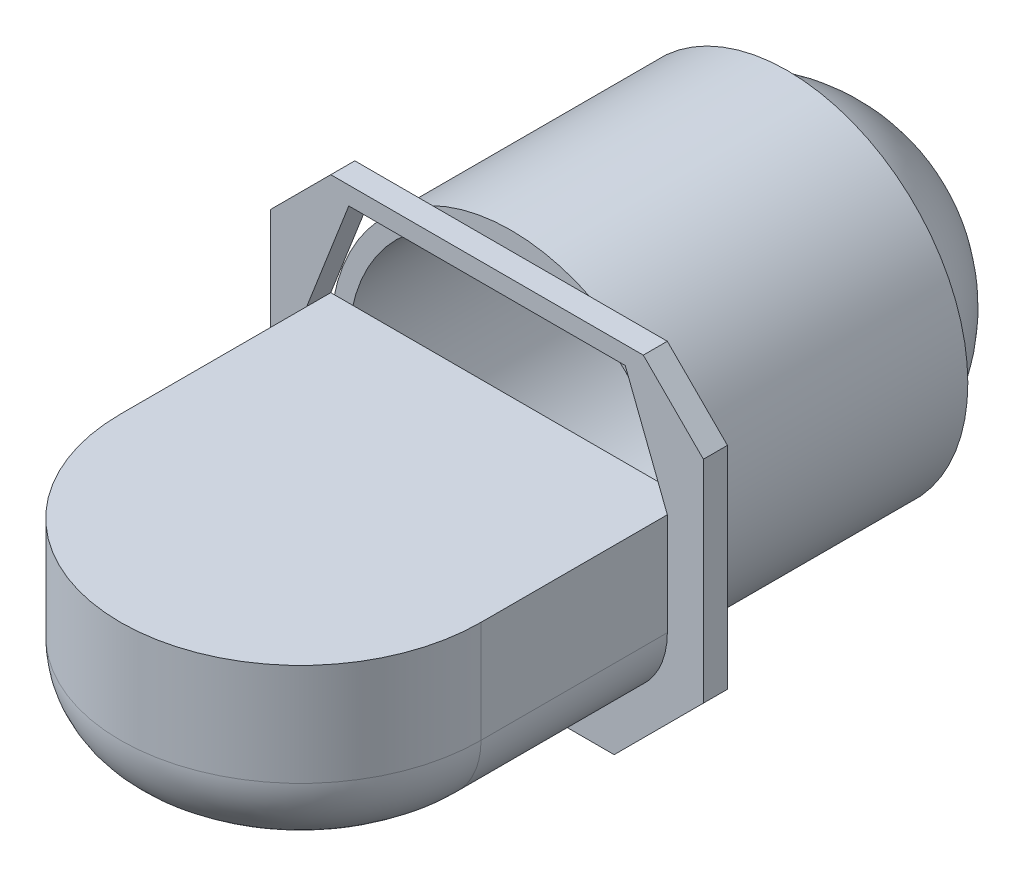
ISO-10303-21;
HEADER;
FILE_DESCRIPTION(('STEP AP214'),'2;1');
FILE_NAME('part.step','',(''),(''),'','','');
FILE_SCHEMA(('AUTOMOTIVE_DESIGN { 1 0 10303 214 1 1 1 1 }'));
ENDSEC;
DATA;
#1=APPLICATION_CONTEXT('core data for automotive mechanical design processes');
#2=APPLICATION_PROTOCOL_DEFINITION('international standard','automotive_design',2000,#1);
#3=PRODUCT_CONTEXT('',#1,'mechanical');
#4=PRODUCT('Part','Part','',(#3));
#5=PRODUCT_RELATED_PRODUCT_CATEGORY('part','',(#4));
#6=PRODUCT_DEFINITION_FORMATION('','',#4);
#7=PRODUCT_DEFINITION_CONTEXT('part definition',#1,'design');
#8=PRODUCT_DEFINITION('design','',#6,#7);
#9=PRODUCT_DEFINITION_SHAPE('','',#8);
#10=(LENGTH_UNIT() NAMED_UNIT(*) SI_UNIT(.MILLI.,.METRE.));
#11=(NAMED_UNIT(*) PLANE_ANGLE_UNIT() SI_UNIT($,.RADIAN.));
#12=(NAMED_UNIT(*) SI_UNIT($,.STERADIAN.) SOLID_ANGLE_UNIT());
#13=UNCERTAINTY_MEASURE_WITH_UNIT(LENGTH_MEASURE(1.E-05),#10,'distance_accuracy_value','');
#14=(GEOMETRIC_REPRESENTATION_CONTEXT(3) GLOBAL_UNCERTAINTY_ASSIGNED_CONTEXT((#13)) GLOBAL_UNIT_ASSIGNED_CONTEXT((#10,
#11,#12)) REPRESENTATION_CONTEXT('',''));
#15=CARTESIAN_POINT('',(0.,0.,0.));
#16=DIRECTION('',(0.,0.,1.));
#17=DIRECTION('',(1.,0.,0.));
#18=AXIS2_PLACEMENT_3D('',#15,#16,#17);
#19=CARTESIAN_POINT('',(30.,-24.,46.));
#20=DIRECTION('',(0.,0.,-1.));
#21=DIRECTION('',(-1.,0.,0.));
#22=AXIS2_PLACEMENT_3D('',#19,#20,#21);
#23=PLANE('',#22);
#24=DIRECTION('',(-1.,0.,0.));
#25=VECTOR('',#24,1.);
#26=CARTESIAN_POINT('',(30.,6.,46.));
#27=LINE('',#26,#25);
#28=CARTESIAN_POINT('',(30.,6.,46.));
#29=VERTEX_POINT('',#28);
#30=CARTESIAN_POINT('',(-30.,6.,46.));
#31=VERTEX_POINT('',#30);
#32=EDGE_CURVE('E193',#29,#31,#27,.T.);
#33=ORIENTED_EDGE('',*,*,#32,.F.);
#34=DIRECTION('',(-0.362446261154949,0.932004671541296,0.));
#35=VECTOR('',#34,1.);
#36=CARTESIAN_POINT('',(30.,6.,46.));
#37=LINE('',#36,#35);
#38=CARTESIAN_POINT('',(23.,24.,46.));
#39=VERTEX_POINT('',#38);
#40=EDGE_CURVE('E258',#29,#39,#37,.T.);
#41=ORIENTED_EDGE('',*,*,#40,.T.);
#42=DIRECTION('',(-1.,0.,0.));
#43=VECTOR('',#42,1.);
#44=CARTESIAN_POINT('',(23.,24.,46.));
#45=LINE('',#44,#43);
#46=CARTESIAN_POINT('',(-23.,24.,46.));
#47=VERTEX_POINT('',#46);
#48=EDGE_CURVE('E185',#39,#47,#45,.T.);
#49=ORIENTED_EDGE('',*,*,#48,.T.);
#50=DIRECTION('',(-0.362446261154948,-0.932004671541296,0.));
#51=VECTOR('',#50,1.);
#52=CARTESIAN_POINT('',(-23.,24.,46.));
#53=LINE('',#52,#51);
#54=EDGE_CURVE('E259',#47,#31,#53,.T.);
#55=ORIENTED_EDGE('',*,*,#54,.T.);
#56=EDGE_LOOP('',(#33,#41,#49,#55));
#57=FACE_BOUND('',#56,.T.);
#58=DIRECTION('',(-0.707106781186549,-0.707106781186546,0.));
#59=VECTOR('',#58,1.);
#60=CARTESIAN_POINT('',(-26.,27.,46.));
#61=LINE('',#60,#59);
#62=CARTESIAN_POINT('',(-26.,27.,46.));
#63=VERTEX_POINT('',#62);
#64=CARTESIAN_POINT('',(-36.,17.,46.));
#65=VERTEX_POINT('',#64);
#66=EDGE_CURVE('E251',#63,#65,#61,.T.);
#67=ORIENTED_EDGE('',*,*,#66,.F.);
#68=DIRECTION('',(-1.,0.,0.));
#69=VECTOR('',#68,1.);
#70=CARTESIAN_POINT('',(26.,27.,46.));
#71=LINE('',#70,#69);
#72=CARTESIAN_POINT('',(26.,27.,46.));
#73=VERTEX_POINT('',#72);
#74=EDGE_CURVE('E274',#73,#63,#71,.T.);
#75=ORIENTED_EDGE('',*,*,#74,.F.);
#76=DIRECTION('',(-0.707106781186549,0.707106781186546,0.));
#77=VECTOR('',#76,1.);
#78=CARTESIAN_POINT('',(36.,17.0000000000001,46.));
#79=LINE('',#78,#77);
#80=CARTESIAN_POINT('',(36.,17.0000000000001,46.));
#81=VERTEX_POINT('',#80);
#82=EDGE_CURVE('E301',#81,#73,#79,.T.);
#83=ORIENTED_EDGE('',*,*,#82,.F.);
#84=DIRECTION('',(0.,1.,0.));
#85=VECTOR('',#84,1.);
#86=CARTESIAN_POINT('',(36.,-18.1507575950825,46.));
#87=LINE('',#86,#85);
#88=CARTESIAN_POINT('',(36.,-18.1507575950825,46.));
#89=VERTEX_POINT('',#88);
#90=EDGE_CURVE('E299',#89,#81,#87,.T.);
#91=ORIENTED_EDGE('',*,*,#90,.F.);
#92=DIRECTION('',(0.707106781186548,0.707106781186547,0.));
#93=VECTOR('',#92,1.);
#94=CARTESIAN_POINT('',(21.1507575950824,-33.,46.));
#95=LINE('',#94,#93);
#96=CARTESIAN_POINT('',(21.1507575950824,-33.,46.));
#97=VERTEX_POINT('',#96);
#98=EDGE_CURVE('E297',#97,#89,#95,.T.);
#99=ORIENTED_EDGE('',*,*,#98,.F.);
#100=DIRECTION('',(1.,0.,0.));
#101=VECTOR('',#100,1.);
#102=CARTESIAN_POINT('',(-21.1507575950825,-33.,46.));
#103=LINE('',#102,#101);
#104=CARTESIAN_POINT('',(-21.1507575950825,-33.,46.));
#105=VERTEX_POINT('',#104);
#106=EDGE_CURVE('E295',#105,#97,#103,.T.);
#107=ORIENTED_EDGE('',*,*,#106,.F.);
#108=DIRECTION('',(0.707106781186548,-0.707106781186547,0.));
#109=VECTOR('',#108,1.);
#110=CARTESIAN_POINT('',(-36.,-18.1507575950825,46.));
#111=LINE('',#110,#109);
#112=CARTESIAN_POINT('',(-36.,-18.1507575950825,46.));
#113=VERTEX_POINT('',#112);
#114=EDGE_CURVE('E293',#113,#105,#111,.T.);
#115=ORIENTED_EDGE('',*,*,#114,.F.);
#116=DIRECTION('',(0.,-1.,0.));
#117=VECTOR('',#116,1.);
#118=CARTESIAN_POINT('',(-36.,17.,46.));
#119=LINE('',#118,#117);
#120=EDGE_CURVE('E291',#65,#113,#119,.T.);
#121=ORIENTED_EDGE('',*,*,#120,.F.);
#122=EDGE_LOOP('',(#67,#75,#83,#91,#99,#107,#115,#121));
#123=FACE_BOUND('',#122,.T.);
#124=ADVANCED_FACE('F47',(#57,#123),#23,.T.);
#125=CARTESIAN_POINT('',(30.,-24.,81.));
#126=DIRECTION('',(1.,0.,0.));
#127=DIRECTION('',(0.,0.,-1.));
#128=AXIS2_PLACEMENT_3D('',#125,#126,#127);
#129=PLANE('',#128);
#130=DIRECTION('',(0.,-1.,0.));
#131=VECTOR('',#130,1.);
#132=CARTESIAN_POINT('',(30.,-24.,50.));
#133=LINE('',#132,#131);
#134=CARTESIAN_POINT('',(30.,6.,50.));
#135=VERTEX_POINT('',#134);
#136=CARTESIAN_POINT('',(30.,-11.,50.));
#137=VERTEX_POINT('',#136);
#138=EDGE_CURVE('E233',#135,#137,#133,.T.);
#139=ORIENTED_EDGE('',*,*,#138,.F.);
#140=DIRECTION('',(0.,0.,-1.));
#141=VECTOR('',#140,1.);
#142=CARTESIAN_POINT('',(30.,6.,81.));
#143=LINE('',#142,#141);
#144=CARTESIAN_POINT('',(30.,6.,81.));
#145=VERTEX_POINT('',#144);
#146=EDGE_CURVE('E201',#145,#135,#143,.T.);
#147=ORIENTED_EDGE('',*,*,#146,.F.);
#148=DIRECTION('',(0.,1.,0.));
#149=VECTOR('',#148,1.);
#150=CARTESIAN_POINT('',(30.,-24.,81.));
#151=LINE('',#150,#149);
#152=CARTESIAN_POINT('',(30.,-11.,81.));
#153=VERTEX_POINT('',#152);
#154=EDGE_CURVE('E206',#153,#145,#151,.T.);
#155=ORIENTED_EDGE('',*,*,#154,.F.);
#156=DIRECTION('',(0.,0.,-1.));
#157=VECTOR('',#156,1.);
#158=CARTESIAN_POINT('',(30.,-11.,46.));
#159=LINE('',#158,#157);
#160=EDGE_CURVE('E208',#153,#137,#159,.T.);
#161=ORIENTED_EDGE('',*,*,#160,.T.);
#162=EDGE_LOOP('',(#139,#147,#155,#161));
#163=FACE_BOUND('',#162,.T.);
#164=ADVANCED_FACE('F243',(#163),#129,.T.);
#165=CARTESIAN_POINT('',(0.,-24.,81.));
#166=DIRECTION('',(0.,1.,0.));
#167=DIRECTION('',(0.,0.,1.));
#168=AXIS2_PLACEMENT_3D('',#165,#166,#167);
#169=CYLINDRICAL_SURFACE('',#168,30.);
#170=DIRECTION('',(0.,1.,0.));
#171=VECTOR('',#170,1.);
#172=CARTESIAN_POINT('',(-30.,-24.,81.));
#173=LINE('',#172,#171);
#174=CARTESIAN_POINT('',(-30.,-11.,81.));
#175=VERTEX_POINT('',#174);
#176=CARTESIAN_POINT('',(-30.,6.,81.));
#177=VERTEX_POINT('',#176);
#178=EDGE_CURVE('E189',#175,#177,#173,.T.);
#179=ORIENTED_EDGE('',*,*,#178,.F.);
#180=CARTESIAN_POINT('',(0.,-11.,81.));
#181=DIRECTION('',(0.,1.,0.));
#182=DIRECTION('',(0.,0.,1.));
#183=AXIS2_PLACEMENT_3D('',#180,#181,#182);
#184=CIRCLE('',#183,30.);
#185=EDGE_CURVE('E218',#175,#153,#184,.T.);
#186=ORIENTED_EDGE('',*,*,#185,.T.);
#187=ORIENTED_EDGE('',*,*,#154,.T.);
#188=CARTESIAN_POINT('',(0.,6.,81.));
#189=DIRECTION('',(0.,1.,0.));
#190=DIRECTION('',(0.,0.,1.));
#191=AXIS2_PLACEMENT_3D('',#188,#189,#190);
#192=CIRCLE('',#191,30.);
#193=EDGE_CURVE('E200',#177,#145,#192,.T.);
#194=ORIENTED_EDGE('',*,*,#193,.F.);
#195=EDGE_LOOP('',(#179,#186,#187,#194));
#196=FACE_BOUND('',#195,.T.);
#197=ADVANCED_FACE('F246',(#196),#169,.T.);
#198=CARTESIAN_POINT('',(-30.,-24.,46.));
#199=DIRECTION('',(-1.,0.,0.));
#200=DIRECTION('',(0.,0.,1.));
#201=AXIS2_PLACEMENT_3D('',#198,#199,#200);
#202=PLANE('',#201);
#203=DIRECTION('',(0.,1.,0.));
#204=VECTOR('',#203,1.);
#205=CARTESIAN_POINT('',(-30.,-24.,50.));
#206=LINE('',#205,#204);
#207=CARTESIAN_POINT('',(-30.,-11.,50.));
#208=VERTEX_POINT('',#207);
#209=CARTESIAN_POINT('',(-30.,6.,50.));
#210=VERTEX_POINT('',#209);
#211=EDGE_CURVE('E166',#208,#210,#206,.T.);
#212=ORIENTED_EDGE('',*,*,#211,.F.);
#213=DIRECTION('',(0.,0.,1.));
#214=VECTOR('',#213,1.);
#215=CARTESIAN_POINT('',(-30.,-11.,81.));
#216=LINE('',#215,#214);
#217=EDGE_CURVE('E55',#208,#175,#216,.T.);
#218=ORIENTED_EDGE('',*,*,#217,.T.);
#219=ORIENTED_EDGE('',*,*,#178,.T.);
#220=DIRECTION('',(0.,0.,1.));
#221=VECTOR('',#220,1.);
#222=CARTESIAN_POINT('',(-30.,6.,46.));
#223=LINE('',#222,#221);
#224=EDGE_CURVE('E187',#210,#177,#223,.T.);
#225=ORIENTED_EDGE('',*,*,#224,.F.);
#226=EDGE_LOOP('',(#212,#218,#219,#225));
#227=FACE_BOUND('',#226,.T.);
#228=ADVANCED_FACE('F188',(#227),#202,.T.);
#229=CARTESIAN_POINT('',(0.,-24.,81.));
#230=DIRECTION('',(0.,1.,0.));
#231=DIRECTION('',(0.,0.,1.));
#232=AXIS2_PLACEMENT_3D('',#229,#230,#231);
#233=PLANE('',#232);
#234=DIRECTION('',(0.,0.,1.));
#235=VECTOR('',#234,1.);
#236=CARTESIAN_POINT('',(-17.,-24.,46.));
#237=LINE('',#236,#235);
#238=CARTESIAN_POINT('',(-17.,-24.,81.));
#239=VERTEX_POINT('',#238);
#240=CARTESIAN_POINT('',(-17.,-24.,50.));
#241=VERTEX_POINT('',#240);
#242=EDGE_CURVE('E212',#239,#241,#237,.F.);
#243=ORIENTED_EDGE('',*,*,#242,.T.);
#244=DIRECTION('',(1.,0.,0.));
#245=VECTOR('',#244,1.);
#246=CARTESIAN_POINT('',(0.,-24.,50.));
#247=LINE('',#246,#245);
#248=CARTESIAN_POINT('',(17.,-24.,50.));
#249=VERTEX_POINT('',#248);
#250=EDGE_CURVE('E232',#241,#249,#247,.T.);
#251=ORIENTED_EDGE('',*,*,#250,.T.);
#252=DIRECTION('',(0.,0.,-1.));
#253=VECTOR('',#252,1.);
#254=CARTESIAN_POINT('',(17.,-24.,81.));
#255=LINE('',#254,#253);
#256=CARTESIAN_POINT('',(17.,-24.,81.));
#257=VERTEX_POINT('',#256);
#258=EDGE_CURVE('E69',#249,#257,#255,.F.);
#259=ORIENTED_EDGE('',*,*,#258,.T.);
#260=CARTESIAN_POINT('',(0.,-24.,81.));
#261=DIRECTION('',(0.,1.,0.));
#262=DIRECTION('',(0.,0.,1.));
#263=AXIS2_PLACEMENT_3D('',#260,#261,#262);
#264=CIRCLE('',#263,17.);
#265=EDGE_CURVE('E215',#257,#239,#264,.F.);
#266=ORIENTED_EDGE('',*,*,#265,.T.);
#267=EDGE_LOOP('',(#243,#251,#259,#266));
#268=FACE_BOUND('',#267,.T.);
#269=ADVANCED_FACE('F231',(#268),#233,.F.);
#270=CARTESIAN_POINT('',(0.,6.,81.));
#271=DIRECTION('',(0.,1.,0.));
#272=DIRECTION('',(0.,0.,1.));
#273=AXIS2_PLACEMENT_3D('',#270,#271,#272);
#274=PLANE('',#273);
#275=ORIENTED_EDGE('',*,*,#146,.T.);
#276=DIRECTION('',(0.,0.,-1.));
#277=VECTOR('',#276,1.);
#278=CARTESIAN_POINT('',(30.,6.,50.));
#279=LINE('',#278,#277);
#280=EDGE_CURVE('E247',#135,#29,#279,.T.);
#281=ORIENTED_EDGE('',*,*,#280,.T.);
#282=ORIENTED_EDGE('',*,*,#32,.T.);
#283=EDGE_CURVE('E180',#31,#210,#223,.T.);
#284=ORIENTED_EDGE('',*,*,#283,.T.);
#285=ORIENTED_EDGE('',*,*,#224,.T.);
#286=ORIENTED_EDGE('',*,*,#193,.T.);
#287=EDGE_LOOP('',(#275,#281,#282,#284,#285,#286));
#288=FACE_BOUND('',#287,.T.);
#289=ADVANCED_FACE('F197',(#288),#274,.T.);
#290=CARTESIAN_POINT('',(-17.,-11.,46.));
#291=DIRECTION('',(0.,0.,-1.));
#292=DIRECTION('',(-1.,0.,0.));
#293=AXIS2_PLACEMENT_3D('',#290,#291,#292);
#294=CYLINDRICAL_SURFACE('',#293,13.);
#295=CARTESIAN_POINT('',(-17.,-11.,50.));
#296=DIRECTION('',(0.,0.,1.));
#297=DIRECTION('',(1.,0.,0.));
#298=AXIS2_PLACEMENT_3D('',#295,#296,#297);
#299=CIRCLE('',#298,13.);
#300=EDGE_CURVE('E172',#241,#208,#299,.F.);
#301=ORIENTED_EDGE('',*,*,#300,.F.);
#302=ORIENTED_EDGE('',*,*,#242,.F.);
#303=CARTESIAN_POINT('',(-17.,-11.,81.));
#304=DIRECTION('',(0.,0.,1.));
#305=DIRECTION('',(1.,0.,0.));
#306=AXIS2_PLACEMENT_3D('',#303,#304,#305);
#307=CIRCLE('',#306,13.);
#308=EDGE_CURVE('E222',#175,#239,#307,.T.);
#309=ORIENTED_EDGE('',*,*,#308,.F.);
#310=ORIENTED_EDGE('',*,*,#217,.F.);
#311=EDGE_LOOP('',(#301,#302,#309,#310));
#312=FACE_BOUND('',#311,.T.);
#313=ADVANCED_FACE('F49',(#312),#294,.T.);
#314=CARTESIAN_POINT('',(0.,-11.,81.));
#315=DIRECTION('',(0.,1.,0.));
#316=DIRECTION('',(0.,0.,1.));
#317=AXIS2_PLACEMENT_3D('',#314,#315,#316);
#318=TOROIDAL_SURFACE('',#317,17.,13.);
#319=ORIENTED_EDGE('',*,*,#308,.T.);
#320=ORIENTED_EDGE('',*,*,#265,.F.);
#321=CARTESIAN_POINT('',(17.,-11.,81.));
#322=DIRECTION('',(0.,0.,-1.));
#323=DIRECTION('',(-1.,0.,0.));
#324=AXIS2_PLACEMENT_3D('',#321,#322,#323);
#325=CIRCLE('',#324,13.);
#326=EDGE_CURVE('E174',#153,#257,#325,.T.);
#327=ORIENTED_EDGE('',*,*,#326,.F.);
#328=ORIENTED_EDGE('',*,*,#185,.F.);
#329=EDGE_LOOP('',(#319,#320,#327,#328));
#330=FACE_BOUND('',#329,.T.);
#331=ADVANCED_FACE('F227',(#330),#318,.T.);
#332=CARTESIAN_POINT('',(17.,-11.,81.));
#333=DIRECTION('',(0.,0.,1.));
#334=DIRECTION('',(1.,0.,0.));
#335=AXIS2_PLACEMENT_3D('',#332,#333,#334);
#336=CYLINDRICAL_SURFACE('',#335,13.);
#337=CARTESIAN_POINT('',(17.,-11.,50.));
#338=DIRECTION('',(0.,0.,1.));
#339=DIRECTION('',(1.,0.,0.));
#340=AXIS2_PLACEMENT_3D('',#337,#338,#339);
#341=CIRCLE('',#340,13.);
#342=EDGE_CURVE('E12',#137,#249,#341,.F.);
#343=ORIENTED_EDGE('',*,*,#342,.F.);
#344=ORIENTED_EDGE('',*,*,#160,.F.);
#345=ORIENTED_EDGE('',*,*,#326,.T.);
#346=ORIENTED_EDGE('',*,*,#258,.F.);
#347=EDGE_LOOP('',(#343,#344,#345,#346));
#348=FACE_BOUND('',#347,.T.);
#349=ADVANCED_FACE('F238',(#348),#336,.T.);
#350=CARTESIAN_POINT('',(0.,0.,50.));
#351=DIRECTION('',(0.,0.,1.));
#352=DIRECTION('',(1.,0.,0.));
#353=AXIS2_PLACEMENT_3D('',#350,#351,#352);
#354=PLANE('',#353);
#355=DIRECTION('',(-0.707106781186549,-0.707106781186546,0.));
#356=VECTOR('',#355,1.);
#357=CARTESIAN_POINT('',(-26.,27.,50.));
#358=LINE('',#357,#356);
#359=CARTESIAN_POINT('',(-26.,27.,50.));
#360=VERTEX_POINT('',#359);
#361=CARTESIAN_POINT('',(-36.,17.,50.));
#362=VERTEX_POINT('',#361);
#363=EDGE_CURVE('E270',#360,#362,#358,.T.);
#364=ORIENTED_EDGE('',*,*,#363,.T.);
#365=DIRECTION('',(0.,-1.,0.));
#366=VECTOR('',#365,1.);
#367=CARTESIAN_POINT('',(-36.,17.,50.));
#368=LINE('',#367,#366);
#369=CARTESIAN_POINT('',(-36.,-18.1507575950825,50.));
#370=VERTEX_POINT('',#369);
#371=EDGE_CURVE('E273',#362,#370,#368,.T.);
#372=ORIENTED_EDGE('',*,*,#371,.T.);
#373=DIRECTION('',(0.707106781186548,-0.707106781186547,0.));
#374=VECTOR('',#373,1.);
#375=CARTESIAN_POINT('',(-36.,-18.1507575950825,50.));
#376=LINE('',#375,#374);
#377=CARTESIAN_POINT('',(-21.1507575950825,-33.,50.));
#378=VERTEX_POINT('',#377);
#379=EDGE_CURVE('E276',#370,#378,#376,.T.);
#380=ORIENTED_EDGE('',*,*,#379,.T.);
#381=DIRECTION('',(1.,0.,0.));
#382=VECTOR('',#381,1.);
#383=CARTESIAN_POINT('',(-21.1507575950825,-33.,50.));
#384=LINE('',#383,#382);
#385=CARTESIAN_POINT('',(21.1507575950824,-33.,50.));
#386=VERTEX_POINT('',#385);
#387=EDGE_CURVE('E278',#378,#386,#384,.T.);
#388=ORIENTED_EDGE('',*,*,#387,.T.);
#389=DIRECTION('',(0.707106781186548,0.707106781186547,0.));
#390=VECTOR('',#389,1.);
#391=CARTESIAN_POINT('',(21.1507575950824,-33.,50.));
#392=LINE('',#391,#390);
#393=CARTESIAN_POINT('',(36.,-18.1507575950825,50.));
#394=VERTEX_POINT('',#393);
#395=EDGE_CURVE('E280',#386,#394,#392,.T.);
#396=ORIENTED_EDGE('',*,*,#395,.T.);
#397=DIRECTION('',(0.,1.,0.));
#398=VECTOR('',#397,1.);
#399=CARTESIAN_POINT('',(36.,-18.1507575950825,50.));
#400=LINE('',#399,#398);
#401=CARTESIAN_POINT('',(36.,17.0000000000001,50.));
#402=VERTEX_POINT('',#401);
#403=EDGE_CURVE('E282',#394,#402,#400,.T.);
#404=ORIENTED_EDGE('',*,*,#403,.T.);
#405=DIRECTION('',(-0.707106781186549,0.707106781186546,0.));
#406=VECTOR('',#405,1.);
#407=CARTESIAN_POINT('',(36.,17.0000000000001,50.));
#408=LINE('',#407,#406);
#409=CARTESIAN_POINT('',(26.,27.,50.));
#410=VERTEX_POINT('',#409);
#411=EDGE_CURVE('E284',#402,#410,#408,.T.);
#412=ORIENTED_EDGE('',*,*,#411,.T.);
#413=DIRECTION('',(-1.,0.,0.));
#414=VECTOR('',#413,1.);
#415=CARTESIAN_POINT('',(26.,27.,50.));
#416=LINE('',#415,#414);
#417=EDGE_CURVE('E286',#410,#360,#416,.T.);
#418=ORIENTED_EDGE('',*,*,#417,.T.);
#419=EDGE_LOOP('',(#364,#372,#380,#388,#396,#404,#412,#418));
#420=FACE_BOUND('',#419,.T.);
#421=ORIENTED_EDGE('',*,*,#300,.T.);
#422=ORIENTED_EDGE('',*,*,#211,.T.);
#423=DIRECTION('',(-0.362446261154948,-0.932004671541296,0.));
#424=VECTOR('',#423,1.);
#425=CARTESIAN_POINT('',(-23.,24.,50.));
#426=LINE('',#425,#424);
#427=CARTESIAN_POINT('',(-23.,24.,50.));
#428=VERTEX_POINT('',#427);
#429=EDGE_CURVE('E170',#428,#210,#426,.T.);
#430=ORIENTED_EDGE('',*,*,#429,.F.);
#431=DIRECTION('',(-1.,0.,0.));
#432=VECTOR('',#431,1.);
#433=CARTESIAN_POINT('',(23.,24.,50.));
#434=LINE('',#433,#432);
#435=CARTESIAN_POINT('',(23.,24.,50.));
#436=VERTEX_POINT('',#435);
#437=EDGE_CURVE('E264',#436,#428,#434,.T.);
#438=ORIENTED_EDGE('',*,*,#437,.F.);
#439=DIRECTION('',(-0.362446261154949,0.932004671541296,0.));
#440=VECTOR('',#439,1.);
#441=CARTESIAN_POINT('',(30.,6.,50.));
#442=LINE('',#441,#440);
#443=EDGE_CURVE('E184',#135,#436,#442,.T.);
#444=ORIENTED_EDGE('',*,*,#443,.F.);
#445=ORIENTED_EDGE('',*,*,#138,.T.);
#446=ORIENTED_EDGE('',*,*,#342,.T.);
#447=ORIENTED_EDGE('',*,*,#250,.F.);
#448=EDGE_LOOP('',(#421,#422,#430,#438,#444,#445,#446,#447));
#449=FACE_BOUND('',#448,.T.);
#450=ADVANCED_FACE('F168',(#420,#449),#354,.T.);
#451=CARTESIAN_POINT('',(-26.,27.,50.));
#452=DIRECTION('',(0.707106781186546,-0.707106781186549,0.));
#453=DIRECTION('',(0.707106781186549,0.707106781186546,0.));
#454=AXIS2_PLACEMENT_3D('',#451,#452,#453);
#455=PLANE('',#454);
#456=ORIENTED_EDGE('',*,*,#66,.T.);
#457=DIRECTION('',(0.,0.,-1.));
#458=VECTOR('',#457,1.);
#459=CARTESIAN_POINT('',(-36.,17.,50.));
#460=LINE('',#459,#458);
#461=EDGE_CURVE('E234',#362,#65,#460,.T.);
#462=ORIENTED_EDGE('',*,*,#461,.F.);
#463=ORIENTED_EDGE('',*,*,#363,.F.);
#464=DIRECTION('',(0.,0.,-1.));
#465=VECTOR('',#464,1.);
#466=CARTESIAN_POINT('',(-26.,27.,50.));
#467=LINE('',#466,#465);
#468=EDGE_CURVE('E288',#360,#63,#467,.T.);
#469=ORIENTED_EDGE('',*,*,#468,.T.);
#470=EDGE_LOOP('',(#456,#462,#463,#469));
#471=FACE_BOUND('',#470,.T.);
#472=ADVANCED_FACE('F362',(#471),#455,.F.);
#473=CARTESIAN_POINT('',(-36.,17.,50.));
#474=DIRECTION('',(1.,0.,0.));
#475=DIRECTION('',(0.,0.,-1.));
#476=AXIS2_PLACEMENT_3D('',#473,#474,#475);
#477=PLANE('',#476);
#478=ORIENTED_EDGE('',*,*,#120,.T.);
#479=DIRECTION('',(0.,0.,-1.));
#480=VECTOR('',#479,1.);
#481=CARTESIAN_POINT('',(-36.,-18.1507575950825,50.));
#482=LINE('',#481,#480);
#483=EDGE_CURVE('E321',#370,#113,#482,.T.);
#484=ORIENTED_EDGE('',*,*,#483,.F.);
#485=ORIENTED_EDGE('',*,*,#371,.F.);
#486=ORIENTED_EDGE('',*,*,#461,.T.);
#487=EDGE_LOOP('',(#478,#484,#485,#486));
#488=FACE_BOUND('',#487,.T.);
#489=ADVANCED_FACE('F409',(#488),#477,.F.);
#490=CARTESIAN_POINT('',(-36.,-18.1507575950825,50.));
#491=DIRECTION('',(0.707106781186547,0.707106781186548,0.));
#492=DIRECTION('',(-0.707106781186548,0.707106781186547,0.));
#493=AXIS2_PLACEMENT_3D('',#490,#491,#492);
#494=PLANE('',#493);
#495=ORIENTED_EDGE('',*,*,#114,.T.);
#496=DIRECTION('',(0.,0.,-1.));
#497=VECTOR('',#496,1.);
#498=CARTESIAN_POINT('',(-21.1507575950825,-33.,50.));
#499=LINE('',#498,#497);
#500=EDGE_CURVE('E318',#378,#105,#499,.T.);
#501=ORIENTED_EDGE('',*,*,#500,.F.);
#502=ORIENTED_EDGE('',*,*,#379,.F.);
#503=ORIENTED_EDGE('',*,*,#483,.T.);
#504=EDGE_LOOP('',(#495,#501,#502,#503));
#505=FACE_BOUND('',#504,.T.);
#506=ADVANCED_FACE('F418',(#505),#494,.F.);
#507=CARTESIAN_POINT('',(-21.1507575950825,-33.,50.));
#508=DIRECTION('',(0.,1.,0.));
#509=DIRECTION('',(-1.,0.,0.));
#510=AXIS2_PLACEMENT_3D('',#507,#508,#509);
#511=PLANE('',#510);
#512=ORIENTED_EDGE('',*,*,#106,.T.);
#513=DIRECTION('',(0.,0.,-1.));
#514=VECTOR('',#513,1.);
#515=CARTESIAN_POINT('',(21.1507575950824,-33.,50.));
#516=LINE('',#515,#514);
#517=EDGE_CURVE('E315',#386,#97,#516,.T.);
#518=ORIENTED_EDGE('',*,*,#517,.F.);
#519=ORIENTED_EDGE('',*,*,#387,.F.);
#520=ORIENTED_EDGE('',*,*,#500,.T.);
#521=EDGE_LOOP('',(#512,#518,#519,#520));
#522=FACE_BOUND('',#521,.T.);
#523=ADVANCED_FACE('F427',(#522),#511,.F.);
#524=CARTESIAN_POINT('',(21.1507575950824,-33.,50.));
#525=DIRECTION('',(-0.707106781186547,0.707106781186548,0.));
#526=DIRECTION('',(-0.707106781186548,-0.707106781186547,0.));
#527=AXIS2_PLACEMENT_3D('',#524,#525,#526);
#528=PLANE('',#527);
#529=ORIENTED_EDGE('',*,*,#98,.T.);
#530=DIRECTION('',(0.,0.,-1.));
#531=VECTOR('',#530,1.);
#532=CARTESIAN_POINT('',(36.,-18.1507575950825,50.));
#533=LINE('',#532,#531);
#534=EDGE_CURVE('E312',#394,#89,#533,.T.);
#535=ORIENTED_EDGE('',*,*,#534,.F.);
#536=ORIENTED_EDGE('',*,*,#395,.F.);
#537=ORIENTED_EDGE('',*,*,#517,.T.);
#538=EDGE_LOOP('',(#529,#535,#536,#537));
#539=FACE_BOUND('',#538,.T.);
#540=ADVANCED_FACE('F437',(#539),#528,.F.);
#541=CARTESIAN_POINT('',(36.,-18.1507575950825,50.));
#542=DIRECTION('',(-1.,0.,0.));
#543=DIRECTION('',(0.,-1.,0.));
#544=AXIS2_PLACEMENT_3D('',#541,#542,#543);
#545=PLANE('',#544);
#546=ORIENTED_EDGE('',*,*,#90,.T.);
#547=DIRECTION('',(0.,0.,-1.));
#548=VECTOR('',#547,1.);
#549=CARTESIAN_POINT('',(36.,17.0000000000001,50.));
#550=LINE('',#549,#548);
#551=EDGE_CURVE('E309',#402,#81,#550,.T.);
#552=ORIENTED_EDGE('',*,*,#551,.F.);
#553=ORIENTED_EDGE('',*,*,#403,.F.);
#554=ORIENTED_EDGE('',*,*,#534,.T.);
#555=EDGE_LOOP('',(#546,#552,#553,#554));
#556=FACE_BOUND('',#555,.T.);
#557=ADVANCED_FACE('F447',(#556),#545,.F.);
#558=CARTESIAN_POINT('',(36.,17.0000000000001,50.));
#559=DIRECTION('',(-0.707106781186546,-0.707106781186549,0.));
#560=DIRECTION('',(0.707106781186549,-0.707106781186546,0.));
#561=AXIS2_PLACEMENT_3D('',#558,#559,#560);
#562=PLANE('',#561);
#563=ORIENTED_EDGE('',*,*,#82,.T.);
#564=DIRECTION('',(0.,0.,-1.));
#565=VECTOR('',#564,1.);
#566=CARTESIAN_POINT('',(26.,27.,50.));
#567=LINE('',#566,#565);
#568=EDGE_CURVE('E306',#410,#73,#567,.T.);
#569=ORIENTED_EDGE('',*,*,#568,.F.);
#570=ORIENTED_EDGE('',*,*,#411,.F.);
#571=ORIENTED_EDGE('',*,*,#551,.T.);
#572=EDGE_LOOP('',(#563,#569,#570,#571));
#573=FACE_BOUND('',#572,.T.);
#574=ADVANCED_FACE('F457',(#573),#562,.F.);
#575=CARTESIAN_POINT('',(26.,27.,50.));
#576=DIRECTION('',(0.,-1.,0.));
#577=DIRECTION('',(1.,0.,0.));
#578=AXIS2_PLACEMENT_3D('',#575,#576,#577);
#579=PLANE('',#578);
#580=ORIENTED_EDGE('',*,*,#74,.T.);
#581=ORIENTED_EDGE('',*,*,#468,.F.);
#582=ORIENTED_EDGE('',*,*,#417,.F.);
#583=ORIENTED_EDGE('',*,*,#568,.T.);
#584=EDGE_LOOP('',(#580,#581,#582,#583));
#585=FACE_BOUND('',#584,.T.);
#586=ADVANCED_FACE('F337',(#585),#579,.F.);
#587=CARTESIAN_POINT('',(-23.,24.,50.));
#588=DIRECTION('',(0.932004671541296,-0.362446261154948,0.));
#589=DIRECTION('',(0.362446261154948,0.932004671541296,0.));
#590=AXIS2_PLACEMENT_3D('',#587,#588,#589);
#591=PLANE('',#590);
#592=ORIENTED_EDGE('',*,*,#54,.F.);
#593=DIRECTION('',(0.,0.,-1.));
#594=VECTOR('',#593,1.);
#595=CARTESIAN_POINT('',(-23.,24.,50.));
#596=LINE('',#595,#594);
#597=EDGE_CURVE('E183',#428,#47,#596,.T.);
#598=ORIENTED_EDGE('',*,*,#597,.F.);
#599=ORIENTED_EDGE('',*,*,#429,.T.);
#600=ORIENTED_EDGE('',*,*,#283,.F.);
#601=EDGE_LOOP('',(#592,#598,#599,#600));
#602=FACE_BOUND('',#601,.T.);
#603=ADVANCED_FACE('F178',(#602),#591,.T.);
#604=CARTESIAN_POINT('',(30.,6.,50.));
#605=DIRECTION('',(-0.932004671541296,-0.362446261154949,0.));
#606=DIRECTION('',(0.362446261154949,-0.932004671541296,0.));
#607=AXIS2_PLACEMENT_3D('',#604,#605,#606);
#608=PLANE('',#607);
#609=ORIENTED_EDGE('',*,*,#40,.F.);
#610=ORIENTED_EDGE('',*,*,#280,.F.);
#611=ORIENTED_EDGE('',*,*,#443,.T.);
#612=DIRECTION('',(0.,0.,-1.));
#613=VECTOR('',#612,1.);
#614=CARTESIAN_POINT('',(23.,24.,50.));
#615=LINE('',#614,#613);
#616=EDGE_CURVE('E252',#436,#39,#615,.T.);
#617=ORIENTED_EDGE('',*,*,#616,.T.);
#618=EDGE_LOOP('',(#609,#610,#611,#617));
#619=FACE_BOUND('',#618,.T.);
#620=ADVANCED_FACE('F329',(#619),#608,.T.);
#621=CARTESIAN_POINT('',(23.,24.,50.));
#622=DIRECTION('',(0.,-1.,0.));
#623=DIRECTION('',(1.,0.,0.));
#624=AXIS2_PLACEMENT_3D('',#621,#622,#623);
#625=PLANE('',#624);
#626=ORIENTED_EDGE('',*,*,#48,.F.);
#627=ORIENTED_EDGE('',*,*,#616,.F.);
#628=ORIENTED_EDGE('',*,*,#437,.T.);
#629=ORIENTED_EDGE('',*,*,#597,.T.);
#630=EDGE_LOOP('',(#626,#627,#628,#629));
#631=FACE_BOUND('',#630,.T.);
#632=ADVANCED_FACE('F328',(#631),#625,.T.);
#633=CLOSED_SHELL('',(#124,#164,#197,#228,#269,#289,#313,#331,#349,#450,#472,#489,#506,#523,
#540,#557,#574,#586,#603,#620,#632));
#634=MANIFOLD_SOLID_BREP('B2',#633);
#635=CARTESIAN_POINT('',(0.,0.,8.22499999999999));
#636=DIRECTION('',(0.,0.,-1.));
#637=DIRECTION('',(1.,0.,0.));
#638=AXIS2_PLACEMENT_3D('',#635,#636,#637);
#639=SPHERICAL_SURFACE('',#638,28.225);
#640=CARTESIAN_POINT('',(0.,0.,0.));
#641=DIRECTION('',(0.,0.,-1.));
#642=DIRECTION('',(-1.,0.,0.));
#643=AXIS2_PLACEMENT_3D('',#640,#641,#642);
#644=CIRCLE('',#643,27.);
#645=CARTESIAN_POINT('',(-27.,0.,0.));
#646=VERTEX_POINT('',#645);
#647=EDGE_CURVE('E46',#646,#646,#644,.T.);
#648=ORIENTED_EDGE('',*,*,#647,.T.);
#649=EDGE_LOOP('',(#648));
#650=FACE_BOUND('',#649,.T.);
#651=ADVANCED_FACE('F547',(#650),#639,.T.);
#652=CARTESIAN_POINT('',(27.,0.,0.));
#653=DIRECTION('',(0.,0.,-1.));
#654=DIRECTION('',(-1.,0.,0.));
#655=AXIS2_PLACEMENT_3D('',#652,#653,#654);
#656=PLANE('',#655);
#657=ORIENTED_EDGE('',*,*,#647,.F.);
#658=EDGE_LOOP('',(#657));
#659=FACE_BOUND('',#658,.T.);
#660=ADVANCED_FACE('F555',(#659),#656,.F.);
#661=CLOSED_SHELL('',(#651,#660));
#662=MANIFOLD_SOLID_BREP('B6',#661);
#663=CARTESIAN_POINT('',(0.,0.,46.));
#664=DIRECTION('',(0.,0.,1.));
#665=DIRECTION('',(1.,0.,0.));
#666=AXIS2_PLACEMENT_3D('',#663,#664,#665);
#667=PLANE('',#666);
#668=CARTESIAN_POINT('',(0.,0.,46.));
#669=DIRECTION('',(0.,0.,1.));
#670=DIRECTION('',(1.,0.,0.));
#671=AXIS2_PLACEMENT_3D('',#668,#669,#670);
#672=CIRCLE('',#671,30.);
#673=CARTESIAN_POINT('',(30.,0.,46.));
#674=VERTEX_POINT('',#673);
#675=EDGE_CURVE('E546',#674,#674,#672,.T.);
#676=ORIENTED_EDGE('',*,*,#675,.T.);
#677=EDGE_LOOP('',(#676));
#678=FACE_BOUND('',#677,.T.);
#679=CARTESIAN_POINT('',(0.,0.,46.));
#680=DIRECTION('',(0.,0.,1.));
#681=DIRECTION('',(1.,0.,0.));
#682=AXIS2_PLACEMENT_3D('',#679,#680,#681);
#683=CIRCLE('',#682,27.);
#684=CARTESIAN_POINT('',(27.,0.,46.));
#685=VERTEX_POINT('',#684);
#686=EDGE_CURVE('E583',#685,#685,#683,.T.);
#687=ORIENTED_EDGE('',*,*,#686,.F.);
#688=EDGE_LOOP('',(#687));
#689=FACE_BOUND('',#688,.T.);
#690=ADVANCED_FACE('F572',(#678,#689),#667,.T.);
#691=CARTESIAN_POINT('',(0.,0.,0.));
#692=DIRECTION('',(0.,0.,1.));
#693=DIRECTION('',(1.,0.,0.));
#694=AXIS2_PLACEMENT_3D('',#691,#692,#693);
#695=PLANE('',#694);
#696=CARTESIAN_POINT('',(0.,0.,0.));
#697=DIRECTION('',(0.,0.,1.));
#698=DIRECTION('',(1.,0.,0.));
#699=AXIS2_PLACEMENT_3D('',#696,#697,#698);
#700=CIRCLE('',#699,30.);
#701=CARTESIAN_POINT('',(30.,0.,0.));
#702=VERTEX_POINT('',#701);
#703=EDGE_CURVE('E576',#702,#702,#700,.T.);
#704=ORIENTED_EDGE('',*,*,#703,.F.);
#705=EDGE_LOOP('',(#704));
#706=FACE_BOUND('',#705,.T.);
#707=CARTESIAN_POINT('',(0.,0.,0.));
#708=DIRECTION('',(0.,0.,1.));
#709=DIRECTION('',(1.,0.,0.));
#710=AXIS2_PLACEMENT_3D('',#707,#708,#709);
#711=CIRCLE('',#710,27.);
#712=CARTESIAN_POINT('',(27.,0.,0.));
#713=VERTEX_POINT('',#712);
#714=EDGE_CURVE('E585',#713,#713,#711,.T.);
#715=ORIENTED_EDGE('',*,*,#714,.T.);
#716=EDGE_LOOP('',(#715));
#717=FACE_BOUND('',#716,.T.);
#718=ADVANCED_FACE('F595',(#706,#717),#695,.F.);
#719=CARTESIAN_POINT('',(0.,0.,46.));
#720=DIRECTION('',(0.,0.,-1.));
#721=DIRECTION('',(-1.,0.,0.));
#722=AXIS2_PLACEMENT_3D('',#719,#720,#721);
#723=CYLINDRICAL_SURFACE('',#722,30.);
#724=ORIENTED_EDGE('',*,*,#675,.F.);
#725=EDGE_LOOP('',(#724));
#726=FACE_BOUND('',#725,.T.);
#727=ORIENTED_EDGE('',*,*,#703,.T.);
#728=EDGE_LOOP('',(#727));
#729=FACE_BOUND('',#728,.T.);
#730=ADVANCED_FACE('F574',(#726,#729),#723,.T.);
#731=CARTESIAN_POINT('',(0.,0.,46.));
#732=DIRECTION('',(0.,0.,-1.));
#733=DIRECTION('',(-1.,0.,0.));
#734=AXIS2_PLACEMENT_3D('',#731,#732,#733);
#735=CYLINDRICAL_SURFACE('',#734,27.);
#736=ORIENTED_EDGE('',*,*,#686,.T.);
#737=EDGE_LOOP('',(#736));
#738=FACE_BOUND('',#737,.T.);
#739=ORIENTED_EDGE('',*,*,#714,.F.);
#740=EDGE_LOOP('',(#739));
#741=FACE_BOUND('',#740,.T.);
#742=ADVANCED_FACE('F591',(#738,#741),#735,.F.);
#743=CLOSED_SHELL('',(#690,#718,#730,#742));
#744=MANIFOLD_SOLID_BREP('B41',#743);
#745=ADVANCED_BREP_SHAPE_REPRESENTATION('',(#18,#634,#662,#744),#14);
#746=SHAPE_DEFINITION_REPRESENTATION(#9,#745);
ENDSEC;
END-ISO-10303-21;
